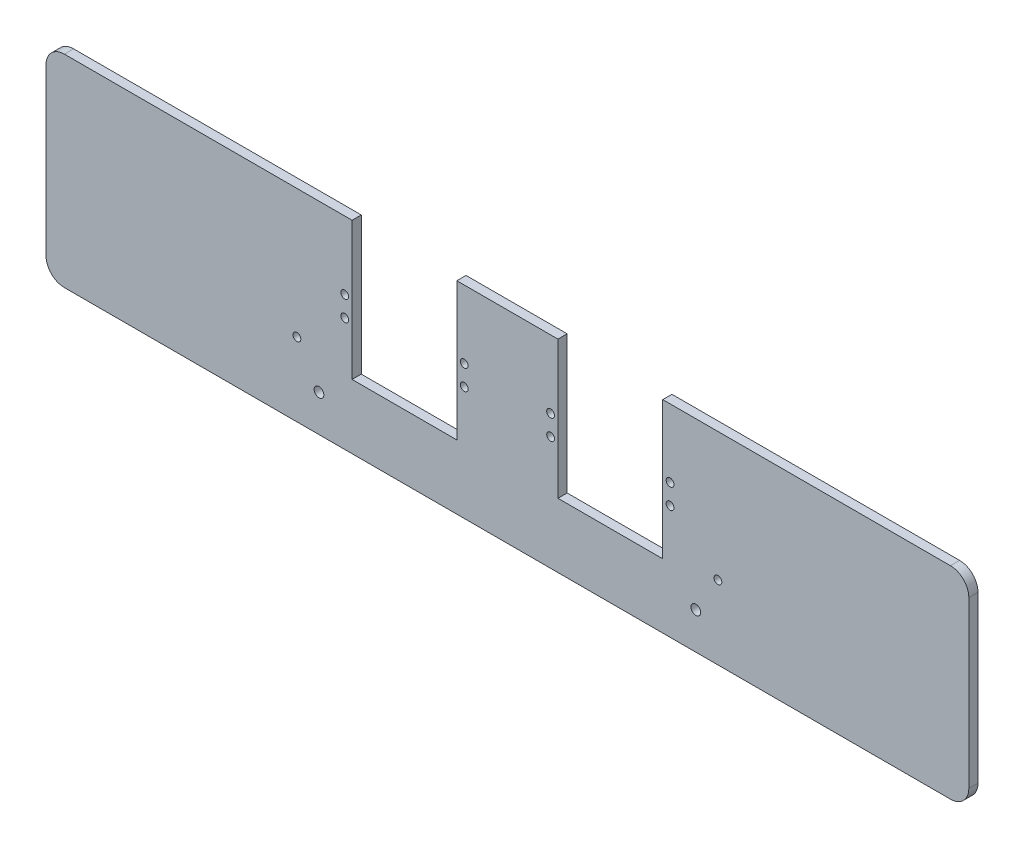
ISO-10303-21;
HEADER;
FILE_DESCRIPTION(('STEP AP214'),'2;1');
FILE_NAME('part.step','',(''),(''),'','','');
FILE_SCHEMA(('AUTOMOTIVE_DESIGN { 1 0 10303 214 1 1 1 1 }'));
ENDSEC;
DATA;
#1=APPLICATION_CONTEXT('core data for automotive mechanical design processes');
#2=APPLICATION_PROTOCOL_DEFINITION('international standard','automotive_design',2000,#1);
#3=PRODUCT_CONTEXT('',#1,'mechanical');
#4=PRODUCT('Part','Part','',(#3));
#5=PRODUCT_RELATED_PRODUCT_CATEGORY('part','',(#4));
#6=PRODUCT_DEFINITION_FORMATION('','',#4);
#7=PRODUCT_DEFINITION_CONTEXT('part definition',#1,'design');
#8=PRODUCT_DEFINITION('design','',#6,#7);
#9=PRODUCT_DEFINITION_SHAPE('','',#8);
#10=(LENGTH_UNIT() NAMED_UNIT(*) SI_UNIT(.MILLI.,.METRE.));
#11=(NAMED_UNIT(*) PLANE_ANGLE_UNIT() SI_UNIT($,.RADIAN.));
#12=(NAMED_UNIT(*) SI_UNIT($,.STERADIAN.) SOLID_ANGLE_UNIT());
#13=UNCERTAINTY_MEASURE_WITH_UNIT(LENGTH_MEASURE(1.E-05),#10,'distance_accuracy_value','');
#14=(GEOMETRIC_REPRESENTATION_CONTEXT(3) GLOBAL_UNCERTAINTY_ASSIGNED_CONTEXT((#13)) GLOBAL_UNIT_ASSIGNED_CONTEXT((#10,
#11,#12)) REPRESENTATION_CONTEXT('',''));
#15=CARTESIAN_POINT('',(0.,0.,0.));
#16=DIRECTION('',(0.,0.,1.));
#17=DIRECTION('',(1.,0.,0.));
#18=AXIS2_PLACEMENT_3D('',#15,#16,#17);
#19=CARTESIAN_POINT('',(502.,0.,5.));
#20=DIRECTION('',(0.,1.,0.));
#21=DIRECTION('',(-1.,0.,0.));
#22=AXIS2_PLACEMENT_3D('',#19,#20,#21);
#23=PLANE('',#22);
#24=DIRECTION('',(1.,0.,0.));
#25=VECTOR('',#24,1.);
#26=CARTESIAN_POINT('',(502.,0.,0.));
#27=LINE('',#26,#25);
#28=CARTESIAN_POINT('',(10.,0.,0.));
#29=VERTEX_POINT('',#28);
#30=CARTESIAN_POINT('',(492.,0.,0.));
#31=VERTEX_POINT('',#30);
#32=EDGE_CURVE('E217',#29,#31,#27,.T.);
#33=ORIENTED_EDGE('',*,*,#32,.T.);
#34=DIRECTION('',(0.,0.,-1.));
#35=VECTOR('',#34,1.);
#36=CARTESIAN_POINT('',(492.,0.,5.));
#37=LINE('',#36,#35);
#38=CARTESIAN_POINT('',(492.,0.,5.));
#39=VERTEX_POINT('',#38);
#40=EDGE_CURVE('E336',#31,#39,#37,.F.);
#41=ORIENTED_EDGE('',*,*,#40,.T.);
#42=DIRECTION('',(1.,0.,0.));
#43=VECTOR('',#42,1.);
#44=CARTESIAN_POINT('',(502.,0.,5.));
#45=LINE('',#44,#43);
#46=CARTESIAN_POINT('',(10.,0.,5.));
#47=VERTEX_POINT('',#46);
#48=EDGE_CURVE('E256',#47,#39,#45,.T.);
#49=ORIENTED_EDGE('',*,*,#48,.F.);
#50=DIRECTION('',(0.,0.,-1.));
#51=VECTOR('',#50,1.);
#52=CARTESIAN_POINT('',(10.,0.,5.));
#53=LINE('',#52,#51);
#54=EDGE_CURVE('E332',#47,#29,#53,.T.);
#55=ORIENTED_EDGE('',*,*,#54,.T.);
#56=EDGE_LOOP('',(#33,#41,#49,#55));
#57=FACE_BOUND('',#56,.T.);
#58=ADVANCED_FACE('F44',(#57),#23,.F.);
#59=CARTESIAN_POINT('',(502.,110.,5.));
#60=DIRECTION('',(-1.,0.,0.));
#61=DIRECTION('',(0.,0.,1.));
#62=AXIS2_PLACEMENT_3D('',#59,#60,#61);
#63=PLANE('',#62);
#64=DIRECTION('',(0.,1.,0.));
#65=VECTOR('',#64,1.);
#66=CARTESIAN_POINT('',(502.,110.,5.));
#67=LINE('',#66,#65);
#68=CARTESIAN_POINT('',(502.,10.,5.));
#69=VERTEX_POINT('',#68);
#70=CARTESIAN_POINT('',(502.,100.,5.));
#71=VERTEX_POINT('',#70);
#72=EDGE_CURVE('E172',#69,#71,#67,.T.);
#73=ORIENTED_EDGE('',*,*,#72,.F.);
#74=DIRECTION('',(0.,0.,-1.));
#75=VECTOR('',#74,1.);
#76=CARTESIAN_POINT('',(502.,10.,5.));
#77=LINE('',#76,#75);
#78=CARTESIAN_POINT('',(502.,10.,0.));
#79=VERTEX_POINT('',#78);
#80=EDGE_CURVE('E316',#69,#79,#77,.T.);
#81=ORIENTED_EDGE('',*,*,#80,.T.);
#82=DIRECTION('',(0.,1.,0.));
#83=VECTOR('',#82,1.);
#84=CARTESIAN_POINT('',(502.,110.,0.));
#85=LINE('',#84,#83);
#86=CARTESIAN_POINT('',(502.,100.,0.));
#87=VERTEX_POINT('',#86);
#88=EDGE_CURVE('E221',#79,#87,#85,.T.);
#89=ORIENTED_EDGE('',*,*,#88,.T.);
#90=DIRECTION('',(0.,0.,-1.));
#91=VECTOR('',#90,1.);
#92=CARTESIAN_POINT('',(502.,100.,5.));
#93=LINE('',#92,#91);
#94=EDGE_CURVE('E182',#87,#71,#93,.F.);
#95=ORIENTED_EDGE('',*,*,#94,.T.);
#96=EDGE_LOOP('',(#73,#81,#89,#95));
#97=FACE_BOUND('',#96,.T.);
#98=ADVANCED_FACE('F482',(#97),#63,.F.);
#99=CARTESIAN_POINT('',(335.5,110.,5.));
#100=DIRECTION('',(0.,-1.,0.));
#101=DIRECTION('',(0.,0.,-1.));
#102=AXIS2_PLACEMENT_3D('',#99,#100,#101);
#103=PLANE('',#102);
#104=DIRECTION('',(-1.,0.,0.));
#105=VECTOR('',#104,1.);
#106=CARTESIAN_POINT('',(335.5,110.,5.));
#107=LINE('',#106,#105);
#108=CARTESIAN_POINT('',(492.,110.,5.));
#109=VERTEX_POINT('',#108);
#110=CARTESIAN_POINT('',(335.5,110.,5.));
#111=VERTEX_POINT('',#110);
#112=EDGE_CURVE('E158',#109,#111,#107,.T.);
#113=ORIENTED_EDGE('',*,*,#112,.F.);
#114=DIRECTION('',(0.,0.,-1.));
#115=VECTOR('',#114,1.);
#116=CARTESIAN_POINT('',(492.,110.,5.));
#117=LINE('',#116,#115);
#118=CARTESIAN_POINT('',(492.,110.,0.));
#119=VERTEX_POINT('',#118);
#120=EDGE_CURVE('E349',#109,#119,#117,.T.);
#121=ORIENTED_EDGE('',*,*,#120,.T.);
#122=DIRECTION('',(-1.,0.,0.));
#123=VECTOR('',#122,1.);
#124=CARTESIAN_POINT('',(335.5,110.,0.));
#125=LINE('',#124,#123);
#126=CARTESIAN_POINT('',(335.5,110.,0.));
#127=VERTEX_POINT('',#126);
#128=EDGE_CURVE('E178',#119,#127,#125,.T.);
#129=ORIENTED_EDGE('',*,*,#128,.T.);
#130=DIRECTION('',(0.,0.,-1.));
#131=VECTOR('',#130,1.);
#132=CARTESIAN_POINT('',(335.5,110.,5.));
#133=LINE('',#132,#131);
#134=EDGE_CURVE('E175',#111,#127,#133,.T.);
#135=ORIENTED_EDGE('',*,*,#134,.F.);
#136=EDGE_LOOP('',(#113,#121,#129,#135));
#137=FACE_BOUND('',#136,.T.);
#138=ADVANCED_FACE('F176',(#137),#103,.F.);
#139=CARTESIAN_POINT('',(335.5,35.,5.));
#140=DIRECTION('',(1.,0.,0.));
#141=DIRECTION('',(0.,0.,-1.));
#142=AXIS2_PLACEMENT_3D('',#139,#140,#141);
#143=PLANE('',#142);
#144=DIRECTION('',(0.,-1.,0.));
#145=VECTOR('',#144,1.);
#146=CARTESIAN_POINT('',(335.5,35.,0.));
#147=LINE('',#146,#145);
#148=CARTESIAN_POINT('',(335.5,35.,0.));
#149=VERTEX_POINT('',#148);
#150=EDGE_CURVE('E228',#127,#149,#147,.T.);
#151=ORIENTED_EDGE('',*,*,#150,.T.);
#152=DIRECTION('',(0.,0.,-1.));
#153=VECTOR('',#152,1.);
#154=CARTESIAN_POINT('',(335.5,35.,5.));
#155=LINE('',#154,#153);
#156=CARTESIAN_POINT('',(335.5,35.,5.));
#157=VERTEX_POINT('',#156);
#158=EDGE_CURVE('E183',#157,#149,#155,.T.);
#159=ORIENTED_EDGE('',*,*,#158,.F.);
#160=DIRECTION('',(0.,-1.,0.));
#161=VECTOR('',#160,1.);
#162=CARTESIAN_POINT('',(335.5,35.,5.));
#163=LINE('',#162,#161);
#164=EDGE_CURVE('E163',#111,#157,#163,.T.);
#165=ORIENTED_EDGE('',*,*,#164,.F.);
#166=ORIENTED_EDGE('',*,*,#134,.T.);
#167=EDGE_LOOP('',(#151,#159,#165,#166));
#168=FACE_BOUND('',#167,.T.);
#169=ADVANCED_FACE('F185',(#168),#143,.F.);
#170=CARTESIAN_POINT('',(278.5,35.,5.));
#171=DIRECTION('',(0.,-1.,0.));
#172=DIRECTION('',(1.,0.,0.));
#173=AXIS2_PLACEMENT_3D('',#170,#171,#172);
#174=PLANE('',#173);
#175=DIRECTION('',(-1.,0.,0.));
#176=VECTOR('',#175,1.);
#177=CARTESIAN_POINT('',(278.5,35.,0.));
#178=LINE('',#177,#176);
#179=CARTESIAN_POINT('',(278.5,35.,0.));
#180=VERTEX_POINT('',#179);
#181=EDGE_CURVE('E231',#149,#180,#178,.T.);
#182=ORIENTED_EDGE('',*,*,#181,.T.);
#183=DIRECTION('',(0.,0.,-1.));
#184=VECTOR('',#183,1.);
#185=CARTESIAN_POINT('',(278.5,35.,5.));
#186=LINE('',#185,#184);
#187=CARTESIAN_POINT('',(278.5,35.,5.));
#188=VERTEX_POINT('',#187);
#189=EDGE_CURVE('E276',#188,#180,#186,.T.);
#190=ORIENTED_EDGE('',*,*,#189,.F.);
#191=DIRECTION('',(-1.,0.,0.));
#192=VECTOR('',#191,1.);
#193=CARTESIAN_POINT('',(278.5,35.,5.));
#194=LINE('',#193,#192);
#195=EDGE_CURVE('E189',#157,#188,#194,.T.);
#196=ORIENTED_EDGE('',*,*,#195,.F.);
#197=ORIENTED_EDGE('',*,*,#158,.T.);
#198=EDGE_LOOP('',(#182,#190,#196,#197));
#199=FACE_BOUND('',#198,.T.);
#200=ADVANCED_FACE('F437',(#199),#174,.F.);
#201=CARTESIAN_POINT('',(278.5,110.,5.));
#202=DIRECTION('',(-1.,0.,0.));
#203=DIRECTION('',(0.,0.,1.));
#204=AXIS2_PLACEMENT_3D('',#201,#202,#203);
#205=PLANE('',#204);
#206=DIRECTION('',(0.,1.,0.));
#207=VECTOR('',#206,1.);
#208=CARTESIAN_POINT('',(278.5,110.,0.));
#209=LINE('',#208,#207);
#210=CARTESIAN_POINT('',(278.5,110.,0.));
#211=VERTEX_POINT('',#210);
#212=EDGE_CURVE('E234',#180,#211,#209,.T.);
#213=ORIENTED_EDGE('',*,*,#212,.T.);
#214=DIRECTION('',(0.,0.,-1.));
#215=VECTOR('',#214,1.);
#216=CARTESIAN_POINT('',(278.5,110.,5.));
#217=LINE('',#216,#215);
#218=CARTESIAN_POINT('',(278.5,110.,5.));
#219=VERTEX_POINT('',#218);
#220=EDGE_CURVE('E272',#219,#211,#217,.T.);
#221=ORIENTED_EDGE('',*,*,#220,.F.);
#222=DIRECTION('',(0.,1.,0.));
#223=VECTOR('',#222,1.);
#224=CARTESIAN_POINT('',(278.5,110.,5.));
#225=LINE('',#224,#223);
#226=EDGE_CURVE('E192',#188,#219,#225,.T.);
#227=ORIENTED_EDGE('',*,*,#226,.F.);
#228=ORIENTED_EDGE('',*,*,#189,.T.);
#229=EDGE_LOOP('',(#213,#221,#227,#228));
#230=FACE_BOUND('',#229,.T.);
#231=ADVANCED_FACE('F444',(#230),#205,.F.);
#232=CARTESIAN_POINT('',(223.5,110.,5.));
#233=DIRECTION('',(0.,-1.,0.));
#234=DIRECTION('',(0.,0.,-1.));
#235=AXIS2_PLACEMENT_3D('',#232,#233,#234);
#236=PLANE('',#235);
#237=DIRECTION('',(-1.,0.,0.));
#238=VECTOR('',#237,1.);
#239=CARTESIAN_POINT('',(223.5,110.,0.));
#240=LINE('',#239,#238);
#241=CARTESIAN_POINT('',(223.5,110.,0.));
#242=VERTEX_POINT('',#241);
#243=EDGE_CURVE('E237',#211,#242,#240,.T.);
#244=ORIENTED_EDGE('',*,*,#243,.T.);
#245=DIRECTION('',(0.,0.,-1.));
#246=VECTOR('',#245,1.);
#247=CARTESIAN_POINT('',(223.5,110.,5.));
#248=LINE('',#247,#246);
#249=CARTESIAN_POINT('',(223.5,110.,5.));
#250=VERTEX_POINT('',#249);
#251=EDGE_CURVE('E268',#250,#242,#248,.T.);
#252=ORIENTED_EDGE('',*,*,#251,.F.);
#253=DIRECTION('',(-1.,0.,0.));
#254=VECTOR('',#253,1.);
#255=CARTESIAN_POINT('',(223.5,110.,5.));
#256=LINE('',#255,#254);
#257=EDGE_CURVE('E198',#219,#250,#256,.T.);
#258=ORIENTED_EDGE('',*,*,#257,.F.);
#259=ORIENTED_EDGE('',*,*,#220,.T.);
#260=EDGE_LOOP('',(#244,#252,#258,#259));
#261=FACE_BOUND('',#260,.T.);
#262=ADVANCED_FACE('F447',(#261),#236,.F.);
#263=CARTESIAN_POINT('',(223.5,35.,5.));
#264=DIRECTION('',(1.,0.,0.));
#265=DIRECTION('',(0.,1.,0.));
#266=AXIS2_PLACEMENT_3D('',#263,#264,#265);
#267=PLANE('',#266);
#268=DIRECTION('',(0.,-1.,0.));
#269=VECTOR('',#268,1.);
#270=CARTESIAN_POINT('',(223.5,35.,0.));
#271=LINE('',#270,#269);
#272=CARTESIAN_POINT('',(223.5,35.,0.));
#273=VERTEX_POINT('',#272);
#274=EDGE_CURVE('E240',#242,#273,#271,.T.);
#275=ORIENTED_EDGE('',*,*,#274,.T.);
#276=DIRECTION('',(0.,0.,-1.));
#277=VECTOR('',#276,1.);
#278=CARTESIAN_POINT('',(223.5,35.,5.));
#279=LINE('',#278,#277);
#280=CARTESIAN_POINT('',(223.5,35.,5.));
#281=VERTEX_POINT('',#280);
#282=EDGE_CURVE('E264',#281,#273,#279,.T.);
#283=ORIENTED_EDGE('',*,*,#282,.F.);
#284=DIRECTION('',(0.,-1.,0.));
#285=VECTOR('',#284,1.);
#286=CARTESIAN_POINT('',(223.5,35.,5.));
#287=LINE('',#286,#285);
#288=EDGE_CURVE('E201',#250,#281,#287,.T.);
#289=ORIENTED_EDGE('',*,*,#288,.F.);
#290=ORIENTED_EDGE('',*,*,#251,.T.);
#291=EDGE_LOOP('',(#275,#283,#289,#290));
#292=FACE_BOUND('',#291,.T.);
#293=ADVANCED_FACE('F452',(#292),#267,.F.);
#294=CARTESIAN_POINT('',(166.5,35.,5.));
#295=DIRECTION('',(0.,-1.,0.));
#296=DIRECTION('',(0.,0.,-1.));
#297=AXIS2_PLACEMENT_3D('',#294,#295,#296);
#298=PLANE('',#297);
#299=DIRECTION('',(-1.,0.,0.));
#300=VECTOR('',#299,1.);
#301=CARTESIAN_POINT('',(166.5,35.,0.));
#302=LINE('',#301,#300);
#303=CARTESIAN_POINT('',(166.5,35.,0.));
#304=VERTEX_POINT('',#303);
#305=EDGE_CURVE('E243',#273,#304,#302,.T.);
#306=ORIENTED_EDGE('',*,*,#305,.T.);
#307=DIRECTION('',(0.,0.,-1.));
#308=VECTOR('',#307,1.);
#309=CARTESIAN_POINT('',(166.5,35.,5.));
#310=LINE('',#309,#308);
#311=CARTESIAN_POINT('',(166.5,35.,5.));
#312=VERTEX_POINT('',#311);
#313=EDGE_CURVE('E260',#312,#304,#310,.T.);
#314=ORIENTED_EDGE('',*,*,#313,.F.);
#315=DIRECTION('',(-1.,0.,0.));
#316=VECTOR('',#315,1.);
#317=CARTESIAN_POINT('',(166.5,35.,5.));
#318=LINE('',#317,#316);
#319=EDGE_CURVE('E204',#281,#312,#318,.T.);
#320=ORIENTED_EDGE('',*,*,#319,.F.);
#321=ORIENTED_EDGE('',*,*,#282,.T.);
#322=EDGE_LOOP('',(#306,#314,#320,#321));
#323=FACE_BOUND('',#322,.T.);
#324=ADVANCED_FACE('F458',(#323),#298,.F.);
#325=CARTESIAN_POINT('',(166.5,110.,5.));
#326=DIRECTION('',(-1.,0.,0.));
#327=DIRECTION('',(0.,-1.,0.));
#328=AXIS2_PLACEMENT_3D('',#325,#326,#327);
#329=PLANE('',#328);
#330=DIRECTION('',(0.,1.,0.));
#331=VECTOR('',#330,1.);
#332=CARTESIAN_POINT('',(166.5,110.,0.));
#333=LINE('',#332,#331);
#334=CARTESIAN_POINT('',(166.5,110.,0.));
#335=VERTEX_POINT('',#334);
#336=EDGE_CURVE('E246',#304,#335,#333,.T.);
#337=ORIENTED_EDGE('',*,*,#336,.T.);
#338=DIRECTION('',(0.,0.,-1.));
#339=VECTOR('',#338,1.);
#340=CARTESIAN_POINT('',(166.5,110.,5.));
#341=LINE('',#340,#339);
#342=CARTESIAN_POINT('',(166.5,110.,5.));
#343=VERTEX_POINT('',#342);
#344=EDGE_CURVE('E216',#343,#335,#341,.T.);
#345=ORIENTED_EDGE('',*,*,#344,.F.);
#346=DIRECTION('',(0.,1.,0.));
#347=VECTOR('',#346,1.);
#348=CARTESIAN_POINT('',(166.5,110.,5.));
#349=LINE('',#348,#347);
#350=EDGE_CURVE('E207',#312,#343,#349,.T.);
#351=ORIENTED_EDGE('',*,*,#350,.F.);
#352=ORIENTED_EDGE('',*,*,#313,.T.);
#353=EDGE_LOOP('',(#337,#345,#351,#352));
#354=FACE_BOUND('',#353,.T.);
#355=ADVANCED_FACE('F462',(#354),#329,.F.);
#356=CARTESIAN_POINT('',(0.,110.,5.));
#357=DIRECTION('',(0.,-1.,0.));
#358=DIRECTION('',(0.,0.,-1.));
#359=AXIS2_PLACEMENT_3D('',#356,#357,#358);
#360=PLANE('',#359);
#361=DIRECTION('',(-1.,0.,0.));
#362=VECTOR('',#361,1.);
#363=CARTESIAN_POINT('',(0.,110.,0.));
#364=LINE('',#363,#362);
#365=CARTESIAN_POINT('',(10.,110.,0.));
#366=VERTEX_POINT('',#365);
#367=EDGE_CURVE('E249',#335,#366,#364,.T.);
#368=ORIENTED_EDGE('',*,*,#367,.T.);
#369=DIRECTION('',(0.,0.,-1.));
#370=VECTOR('',#369,1.);
#371=CARTESIAN_POINT('',(10.,110.,5.));
#372=LINE('',#371,#370);
#373=CARTESIAN_POINT('',(10.,110.,5.));
#374=VERTEX_POINT('',#373);
#375=EDGE_CURVE('E11',#366,#374,#372,.F.);
#376=ORIENTED_EDGE('',*,*,#375,.T.);
#377=DIRECTION('',(-1.,0.,0.));
#378=VECTOR('',#377,1.);
#379=CARTESIAN_POINT('',(0.,110.,5.));
#380=LINE('',#379,#378);
#381=EDGE_CURVE('E210',#343,#374,#380,.T.);
#382=ORIENTED_EDGE('',*,*,#381,.F.);
#383=ORIENTED_EDGE('',*,*,#344,.T.);
#384=EDGE_LOOP('',(#368,#376,#382,#383));
#385=FACE_BOUND('',#384,.T.);
#386=ADVANCED_FACE('F466',(#385),#360,.F.);
#387=CARTESIAN_POINT('',(0.,0.,5.));
#388=DIRECTION('',(1.,0.,0.));
#389=DIRECTION('',(0.,0.,-1.));
#390=AXIS2_PLACEMENT_3D('',#387,#388,#389);
#391=PLANE('',#390);
#392=DIRECTION('',(0.,-1.,0.));
#393=VECTOR('',#392,1.);
#394=CARTESIAN_POINT('',(0.,0.,0.));
#395=LINE('',#394,#393);
#396=CARTESIAN_POINT('',(0.,100.,0.));
#397=VERTEX_POINT('',#396);
#398=CARTESIAN_POINT('',(0.,10.,0.));
#399=VERTEX_POINT('',#398);
#400=EDGE_CURVE('E253',#397,#399,#395,.T.);
#401=ORIENTED_EDGE('',*,*,#400,.T.);
#402=DIRECTION('',(0.,0.,-1.));
#403=VECTOR('',#402,1.);
#404=CARTESIAN_POINT('',(0.,10.,5.));
#405=LINE('',#404,#403);
#406=CARTESIAN_POINT('',(0.,10.,5.));
#407=VERTEX_POINT('',#406);
#408=EDGE_CURVE('E54',#399,#407,#405,.F.);
#409=ORIENTED_EDGE('',*,*,#408,.T.);
#410=DIRECTION('',(0.,-1.,0.));
#411=VECTOR('',#410,1.);
#412=CARTESIAN_POINT('',(0.,0.,5.));
#413=LINE('',#412,#411);
#414=CARTESIAN_POINT('',(0.,100.,5.));
#415=VERTEX_POINT('',#414);
#416=EDGE_CURVE('E213',#415,#407,#413,.T.);
#417=ORIENTED_EDGE('',*,*,#416,.F.);
#418=DIRECTION('',(0.,0.,-1.));
#419=VECTOR('',#418,1.);
#420=CARTESIAN_POINT('',(0.,100.,5.));
#421=LINE('',#420,#419);
#422=EDGE_CURVE('E352',#415,#397,#421,.T.);
#423=ORIENTED_EDGE('',*,*,#422,.T.);
#424=EDGE_LOOP('',(#401,#409,#417,#423));
#425=FACE_BOUND('',#424,.T.);
#426=ADVANCED_FACE('F471',(#425),#391,.F.);
#427=CARTESIAN_POINT('',(0.,0.,5.));
#428=DIRECTION('',(0.,0.,-1.));
#429=DIRECTION('',(-1.,0.,0.));
#430=AXIS2_PLACEMENT_3D('',#427,#428,#429);
#431=PLANE('',#430);
#432=CARTESIAN_POINT('',(365.5,40.,5.));
#433=DIRECTION('',(0.,0.,1.));
#434=DIRECTION('',(1.,0.,0.));
#435=AXIS2_PLACEMENT_3D('',#432,#433,#434);
#436=CIRCLE('',#435,2.125);
#437=CARTESIAN_POINT('',(367.625,40.,5.));
#438=VERTEX_POINT('',#437);
#439=EDGE_CURVE('E370',#438,#438,#436,.T.);
#440=ORIENTED_EDGE('',*,*,#439,.F.);
#441=EDGE_LOOP('',(#440));
#442=FACE_BOUND('',#441,.T.);
#443=CARTESIAN_POINT('',(136.5,40.,5.));
#444=DIRECTION('',(0.,0.,1.));
#445=DIRECTION('',(-1.,0.,0.));
#446=AXIS2_PLACEMENT_3D('',#443,#444,#445);
#447=CIRCLE('',#446,2.125);
#448=CARTESIAN_POINT('',(134.375,40.,5.));
#449=VERTEX_POINT('',#448);
#450=EDGE_CURVE('E378',#449,#449,#447,.T.);
#451=ORIENTED_EDGE('',*,*,#450,.F.);
#452=EDGE_LOOP('',(#451));
#453=FACE_BOUND('',#452,.T.);
#454=CARTESIAN_POINT('',(148.5,20.,5.));
#455=DIRECTION('',(0.,0.,1.));
#456=DIRECTION('',(1.,0.,0.));
#457=AXIS2_PLACEMENT_3D('',#454,#455,#456);
#458=CIRCLE('',#457,2.65000000000001);
#459=CARTESIAN_POINT('',(151.15,20.,5.));
#460=VERTEX_POINT('',#459);
#461=EDGE_CURVE('E363',#460,#460,#458,.T.);
#462=ORIENTED_EDGE('',*,*,#461,.F.);
#463=EDGE_LOOP('',(#462));
#464=FACE_BOUND('',#463,.T.);
#465=CARTESIAN_POINT('',(353.5,20.,5.));
#466=DIRECTION('',(0.,0.,1.));
#467=DIRECTION('',(-1.,0.,0.));
#468=AXIS2_PLACEMENT_3D('',#465,#466,#467);
#469=CIRCLE('',#468,2.64999999999999);
#470=CARTESIAN_POINT('',(350.85,20.,5.));
#471=VERTEX_POINT('',#470);
#472=EDGE_CURVE('E376',#471,#471,#469,.T.);
#473=ORIENTED_EDGE('',*,*,#472,.F.);
#474=EDGE_LOOP('',(#473));
#475=FACE_BOUND('',#474,.T.);
#476=CARTESIAN_POINT('',(162.5,62.,5.));
#477=DIRECTION('',(0.,0.,1.));
#478=DIRECTION('',(1.,0.,0.));
#479=AXIS2_PLACEMENT_3D('',#476,#477,#478);
#480=CIRCLE('',#479,2.125);
#481=CARTESIAN_POINT('',(164.625,62.,5.));
#482=VERTEX_POINT('',#481);
#483=EDGE_CURVE('E404',#482,#482,#480,.T.);
#484=ORIENTED_EDGE('',*,*,#483,.F.);
#485=EDGE_LOOP('',(#484));
#486=FACE_BOUND('',#485,.T.);
#487=CARTESIAN_POINT('',(227.5,62.,5.));
#488=DIRECTION('',(0.,0.,1.));
#489=DIRECTION('',(-1.,0.,0.));
#490=AXIS2_PLACEMENT_3D('',#487,#488,#489);
#491=CIRCLE('',#490,2.125);
#492=CARTESIAN_POINT('',(225.375,62.,5.));
#493=VERTEX_POINT('',#492);
#494=EDGE_CURVE('E408',#493,#493,#491,.T.);
#495=ORIENTED_EDGE('',*,*,#494,.F.);
#496=EDGE_LOOP('',(#495));
#497=FACE_BOUND('',#496,.T.);
#498=CARTESIAN_POINT('',(227.5,73.,5.));
#499=DIRECTION('',(0.,0.,1.));
#500=DIRECTION('',(-1.,0.,0.));
#501=AXIS2_PLACEMENT_3D('',#498,#499,#500);
#502=CIRCLE('',#501,2.125);
#503=CARTESIAN_POINT('',(225.375,73.,5.));
#504=VERTEX_POINT('',#503);
#505=EDGE_CURVE('E412',#504,#504,#502,.T.);
#506=ORIENTED_EDGE('',*,*,#505,.F.);
#507=EDGE_LOOP('',(#506));
#508=FACE_BOUND('',#507,.T.);
#509=CARTESIAN_POINT('',(274.5,73.,5.));
#510=DIRECTION('',(0.,0.,1.));
#511=DIRECTION('',(1.,0.,0.));
#512=AXIS2_PLACEMENT_3D('',#509,#510,#511);
#513=CIRCLE('',#512,2.125);
#514=CARTESIAN_POINT('',(276.625,73.,5.));
#515=VERTEX_POINT('',#514);
#516=EDGE_CURVE('E396',#515,#515,#513,.T.);
#517=ORIENTED_EDGE('',*,*,#516,.F.);
#518=EDGE_LOOP('',(#517));
#519=FACE_BOUND('',#518,.T.);
#520=CARTESIAN_POINT('',(274.5,62.,5.));
#521=DIRECTION('',(0.,0.,1.));
#522=DIRECTION('',(1.,0.,0.));
#523=AXIS2_PLACEMENT_3D('',#520,#521,#522);
#524=CIRCLE('',#523,2.125);
#525=CARTESIAN_POINT('',(276.625,62.,5.));
#526=VERTEX_POINT('',#525);
#527=EDGE_CURVE('E392',#526,#526,#524,.T.);
#528=ORIENTED_EDGE('',*,*,#527,.F.);
#529=EDGE_LOOP('',(#528));
#530=FACE_BOUND('',#529,.T.);
#531=CARTESIAN_POINT('',(339.5,62.,5.));
#532=DIRECTION('',(0.,0.,1.));
#533=DIRECTION('',(-1.,0.,0.));
#534=AXIS2_PLACEMENT_3D('',#531,#532,#533);
#535=CIRCLE('',#534,2.125);
#536=CARTESIAN_POINT('',(337.375,62.,5.));
#537=VERTEX_POINT('',#536);
#538=EDGE_CURVE('E397',#537,#537,#535,.T.);
#539=ORIENTED_EDGE('',*,*,#538,.F.);
#540=EDGE_LOOP('',(#539));
#541=FACE_BOUND('',#540,.T.);
#542=CARTESIAN_POINT('',(339.5,73.,5.));
#543=DIRECTION('',(0.,0.,1.));
#544=DIRECTION('',(-1.,0.,0.));
#545=AXIS2_PLACEMENT_3D('',#542,#543,#544);
#546=CIRCLE('',#545,2.125);
#547=CARTESIAN_POINT('',(337.375,73.,5.));
#548=VERTEX_POINT('',#547);
#549=EDGE_CURVE('E366',#548,#548,#546,.T.);
#550=ORIENTED_EDGE('',*,*,#549,.F.);
#551=EDGE_LOOP('',(#550));
#552=FACE_BOUND('',#551,.T.);
#553=CARTESIAN_POINT('',(162.5,73.,5.));
#554=DIRECTION('',(0.,0.,1.));
#555=DIRECTION('',(1.,0.,0.));
#556=AXIS2_PLACEMENT_3D('',#553,#554,#555);
#557=CIRCLE('',#556,2.125);
#558=CARTESIAN_POINT('',(164.625,73.,5.));
#559=VERTEX_POINT('',#558);
#560=EDGE_CURVE('E287',#559,#559,#557,.T.);
#561=ORIENTED_EDGE('',*,*,#560,.F.);
#562=EDGE_LOOP('',(#561));
#563=FACE_BOUND('',#562,.T.);
#564=ORIENTED_EDGE('',*,*,#48,.T.);
#565=CARTESIAN_POINT('',(492.,10.,5.));
#566=DIRECTION('',(0.,0.,-1.));
#567=DIRECTION('',(-1.,0.,0.));
#568=AXIS2_PLACEMENT_3D('',#565,#566,#567);
#569=CIRCLE('',#568,10.);
#570=EDGE_CURVE('E346',#39,#69,#569,.F.);
#571=ORIENTED_EDGE('',*,*,#570,.T.);
#572=ORIENTED_EDGE('',*,*,#72,.T.);
#573=CARTESIAN_POINT('',(492.,100.,5.));
#574=DIRECTION('',(0.,0.,-1.));
#575=DIRECTION('',(-1.,0.,0.));
#576=AXIS2_PLACEMENT_3D('',#573,#574,#575);
#577=CIRCLE('',#576,10.);
#578=EDGE_CURVE('E167',#71,#109,#577,.F.);
#579=ORIENTED_EDGE('',*,*,#578,.T.);
#580=ORIENTED_EDGE('',*,*,#112,.T.);
#581=ORIENTED_EDGE('',*,*,#164,.T.);
#582=ORIENTED_EDGE('',*,*,#195,.T.);
#583=ORIENTED_EDGE('',*,*,#226,.T.);
#584=ORIENTED_EDGE('',*,*,#257,.T.);
#585=ORIENTED_EDGE('',*,*,#288,.T.);
#586=ORIENTED_EDGE('',*,*,#319,.T.);
#587=ORIENTED_EDGE('',*,*,#350,.T.);
#588=ORIENTED_EDGE('',*,*,#381,.T.);
#589=CARTESIAN_POINT('',(10.,100.,5.));
#590=DIRECTION('',(0.,0.,-1.));
#591=DIRECTION('',(-1.,0.,0.));
#592=AXIS2_PLACEMENT_3D('',#589,#590,#591);
#593=CIRCLE('',#592,10.);
#594=EDGE_CURVE('E68',#374,#415,#593,.F.);
#595=ORIENTED_EDGE('',*,*,#594,.T.);
#596=ORIENTED_EDGE('',*,*,#416,.T.);
#597=CARTESIAN_POINT('',(10.,10.,5.));
#598=DIRECTION('',(0.,0.,-1.));
#599=DIRECTION('',(-1.,0.,0.));
#600=AXIS2_PLACEMENT_3D('',#597,#598,#599);
#601=CIRCLE('',#600,10.);
#602=EDGE_CURVE('E341',#407,#47,#601,.F.);
#603=ORIENTED_EDGE('',*,*,#602,.T.);
#604=EDGE_LOOP('',(#564,#571,#572,#579,#580,#581,#582,#583,#584,#585,#586,#587,#588,#595,#596,#603));
#605=FACE_BOUND('',#604,.T.);
#606=ADVANCED_FACE('F161',(#442,#453,#464,#475,#486,#497,#508,#519,#530,#541,#552,#563,#605),
#431,.F.);
#607=CARTESIAN_POINT('',(0.,0.,0.));
#608=DIRECTION('',(0.,0.,-1.));
#609=DIRECTION('',(-1.,0.,0.));
#610=AXIS2_PLACEMENT_3D('',#607,#608,#609);
#611=PLANE('',#610);
#612=CARTESIAN_POINT('',(365.5,40.,0.));
#613=DIRECTION('',(0.,0.,-1.));
#614=DIRECTION('',(-1.,0.,0.));
#615=AXIS2_PLACEMENT_3D('',#612,#613,#614);
#616=CIRCLE('',#615,2.125);
#617=CARTESIAN_POINT('',(363.375,40.,0.));
#618=VERTEX_POINT('',#617);
#619=EDGE_CURVE('E48',#618,#618,#616,.T.);
#620=ORIENTED_EDGE('',*,*,#619,.F.);
#621=EDGE_LOOP('',(#620));
#622=FACE_BOUND('',#621,.T.);
#623=CARTESIAN_POINT('',(136.5,40.,0.));
#624=DIRECTION('',(0.,0.,-1.));
#625=DIRECTION('',(-1.,0.,0.));
#626=AXIS2_PLACEMENT_3D('',#623,#624,#625);
#627=CIRCLE('',#626,2.125);
#628=CARTESIAN_POINT('',(134.375,40.,0.));
#629=VERTEX_POINT('',#628);
#630=EDGE_CURVE('E367',#629,#629,#627,.T.);
#631=ORIENTED_EDGE('',*,*,#630,.F.);
#632=EDGE_LOOP('',(#631));
#633=FACE_BOUND('',#632,.T.);
#634=CARTESIAN_POINT('',(148.5,20.,0.));
#635=DIRECTION('',(0.,0.,-1.));
#636=DIRECTION('',(-1.,0.,0.));
#637=AXIS2_PLACEMENT_3D('',#634,#635,#636);
#638=CIRCLE('',#637,2.65000000000001);
#639=CARTESIAN_POINT('',(145.85,20.,0.));
#640=VERTEX_POINT('',#639);
#641=EDGE_CURVE('E362',#640,#640,#638,.T.);
#642=ORIENTED_EDGE('',*,*,#641,.F.);
#643=EDGE_LOOP('',(#642));
#644=FACE_BOUND('',#643,.T.);
#645=CARTESIAN_POINT('',(353.5,20.,0.));
#646=DIRECTION('',(0.,0.,-1.));
#647=DIRECTION('',(-1.,0.,0.));
#648=AXIS2_PLACEMENT_3D('',#645,#646,#647);
#649=CIRCLE('',#648,2.64999999999999);
#650=CARTESIAN_POINT('',(350.85,20.,0.));
#651=VERTEX_POINT('',#650);
#652=EDGE_CURVE('E358',#651,#651,#649,.T.);
#653=ORIENTED_EDGE('',*,*,#652,.F.);
#654=EDGE_LOOP('',(#653));
#655=FACE_BOUND('',#654,.T.);
#656=CARTESIAN_POINT('',(162.5,62.,0.));
#657=DIRECTION('',(0.,0.,-1.));
#658=DIRECTION('',(-1.,0.,0.));
#659=AXIS2_PLACEMENT_3D('',#656,#657,#658);
#660=CIRCLE('',#659,2.125);
#661=CARTESIAN_POINT('',(160.375,62.,0.));
#662=VERTEX_POINT('',#661);
#663=EDGE_CURVE('E222',#662,#662,#660,.T.);
#664=ORIENTED_EDGE('',*,*,#663,.F.);
#665=EDGE_LOOP('',(#664));
#666=FACE_BOUND('',#665,.T.);
#667=CARTESIAN_POINT('',(227.5,62.,0.));
#668=DIRECTION('',(0.,0.,-1.));
#669=DIRECTION('',(-1.,0.,0.));
#670=AXIS2_PLACEMENT_3D('',#667,#668,#669);
#671=CIRCLE('',#670,2.125);
#672=CARTESIAN_POINT('',(225.375,62.,0.));
#673=VERTEX_POINT('',#672);
#674=EDGE_CURVE('E307',#673,#673,#671,.T.);
#675=ORIENTED_EDGE('',*,*,#674,.F.);
#676=EDGE_LOOP('',(#675));
#677=FACE_BOUND('',#676,.T.);
#678=CARTESIAN_POINT('',(227.5,73.,0.));
#679=DIRECTION('',(0.,0.,-1.));
#680=DIRECTION('',(-1.,0.,0.));
#681=AXIS2_PLACEMENT_3D('',#678,#679,#680);
#682=CIRCLE('',#681,2.125);
#683=CARTESIAN_POINT('',(225.375,73.,0.));
#684=VERTEX_POINT('',#683);
#685=EDGE_CURVE('E303',#684,#684,#682,.T.);
#686=ORIENTED_EDGE('',*,*,#685,.F.);
#687=EDGE_LOOP('',(#686));
#688=FACE_BOUND('',#687,.T.);
#689=CARTESIAN_POINT('',(274.5,73.,0.));
#690=DIRECTION('',(0.,0.,-1.));
#691=DIRECTION('',(-1.,0.,0.));
#692=AXIS2_PLACEMENT_3D('',#689,#690,#691);
#693=CIRCLE('',#692,2.125);
#694=CARTESIAN_POINT('',(272.375,73.,0.));
#695=VERTEX_POINT('',#694);
#696=EDGE_CURVE('E299',#695,#695,#693,.T.);
#697=ORIENTED_EDGE('',*,*,#696,.F.);
#698=EDGE_LOOP('',(#697));
#699=FACE_BOUND('',#698,.T.);
#700=CARTESIAN_POINT('',(274.5,62.,0.));
#701=DIRECTION('',(0.,0.,-1.));
#702=DIRECTION('',(-1.,0.,0.));
#703=AXIS2_PLACEMENT_3D('',#700,#701,#702);
#704=CIRCLE('',#703,2.125);
#705=CARTESIAN_POINT('',(272.375,62.,0.));
#706=VERTEX_POINT('',#705);
#707=EDGE_CURVE('E295',#706,#706,#704,.T.);
#708=ORIENTED_EDGE('',*,*,#707,.F.);
#709=EDGE_LOOP('',(#708));
#710=FACE_BOUND('',#709,.T.);
#711=CARTESIAN_POINT('',(339.5,62.,0.));
#712=DIRECTION('',(0.,0.,-1.));
#713=DIRECTION('',(-1.,0.,0.));
#714=AXIS2_PLACEMENT_3D('',#711,#712,#713);
#715=CIRCLE('',#714,2.125);
#716=CARTESIAN_POINT('',(337.375,62.,0.));
#717=VERTEX_POINT('',#716);
#718=EDGE_CURVE('E291',#717,#717,#715,.T.);
#719=ORIENTED_EDGE('',*,*,#718,.F.);
#720=EDGE_LOOP('',(#719));
#721=FACE_BOUND('',#720,.T.);
#722=CARTESIAN_POINT('',(339.5,73.,0.));
#723=DIRECTION('',(0.,0.,-1.));
#724=DIRECTION('',(-1.,0.,0.));
#725=AXIS2_PLACEMENT_3D('',#722,#723,#724);
#726=CIRCLE('',#725,2.125);
#727=CARTESIAN_POINT('',(337.375,73.,0.));
#728=VERTEX_POINT('',#727);
#729=EDGE_CURVE('E286',#728,#728,#726,.T.);
#730=ORIENTED_EDGE('',*,*,#729,.F.);
#731=EDGE_LOOP('',(#730));
#732=FACE_BOUND('',#731,.T.);
#733=CARTESIAN_POINT('',(162.5,73.,0.));
#734=DIRECTION('',(0.,0.,-1.));
#735=DIRECTION('',(-1.,0.,0.));
#736=AXIS2_PLACEMENT_3D('',#733,#734,#735);
#737=CIRCLE('',#736,2.125);
#738=CARTESIAN_POINT('',(160.375,73.,0.));
#739=VERTEX_POINT('',#738);
#740=EDGE_CURVE('E282',#739,#739,#737,.T.);
#741=ORIENTED_EDGE('',*,*,#740,.F.);
#742=EDGE_LOOP('',(#741));
#743=FACE_BOUND('',#742,.T.);
#744=ORIENTED_EDGE('',*,*,#88,.F.);
#745=CARTESIAN_POINT('',(492.,10.,0.));
#746=DIRECTION('',(0.,0.,-1.));
#747=DIRECTION('',(-1.,0.,0.));
#748=AXIS2_PLACEMENT_3D('',#745,#746,#747);
#749=CIRCLE('',#748,10.);
#750=EDGE_CURVE('E329',#79,#31,#749,.T.);
#751=ORIENTED_EDGE('',*,*,#750,.T.);
#752=ORIENTED_EDGE('',*,*,#32,.F.);
#753=CARTESIAN_POINT('',(10.,10.,0.));
#754=DIRECTION('',(0.,0.,-1.));
#755=DIRECTION('',(-1.,0.,0.));
#756=AXIS2_PLACEMENT_3D('',#753,#754,#755);
#757=CIRCLE('',#756,10.);
#758=EDGE_CURVE('E323',#29,#399,#757,.T.);
#759=ORIENTED_EDGE('',*,*,#758,.T.);
#760=ORIENTED_EDGE('',*,*,#400,.F.);
#761=CARTESIAN_POINT('',(10.,100.,0.));
#762=DIRECTION('',(0.,0.,-1.));
#763=DIRECTION('',(-1.,0.,0.));
#764=AXIS2_PLACEMENT_3D('',#761,#762,#763);
#765=CIRCLE('',#764,10.);
#766=EDGE_CURVE('E320',#397,#366,#765,.T.);
#767=ORIENTED_EDGE('',*,*,#766,.T.);
#768=ORIENTED_EDGE('',*,*,#367,.F.);
#769=ORIENTED_EDGE('',*,*,#336,.F.);
#770=ORIENTED_EDGE('',*,*,#305,.F.);
#771=ORIENTED_EDGE('',*,*,#274,.F.);
#772=ORIENTED_EDGE('',*,*,#243,.F.);
#773=ORIENTED_EDGE('',*,*,#212,.F.);
#774=ORIENTED_EDGE('',*,*,#181,.F.);
#775=ORIENTED_EDGE('',*,*,#150,.F.);
#776=ORIENTED_EDGE('',*,*,#128,.F.);
#777=CARTESIAN_POINT('',(492.,100.,0.));
#778=DIRECTION('',(0.,0.,-1.));
#779=DIRECTION('',(-1.,0.,0.));
#780=AXIS2_PLACEMENT_3D('',#777,#778,#779);
#781=CIRCLE('',#780,10.);
#782=EDGE_CURVE('E326',#119,#87,#781,.T.);
#783=ORIENTED_EDGE('',*,*,#782,.T.);
#784=EDGE_LOOP('',(#744,#751,#752,#759,#760,#767,#768,#769,#770,#771,#772,#773,#774,#775,#776,#783));
#785=FACE_BOUND('',#784,.T.);
#786=ADVANCED_FACE('F433',(#622,#633,#644,#655,#666,#677,#688,#699,#710,#721,#732,#743,#785),
#611,.T.);
#787=CARTESIAN_POINT('',(162.5,73.,-5.));
#788=DIRECTION('',(0.,0.,1.));
#789=DIRECTION('',(1.,0.,0.));
#790=AXIS2_PLACEMENT_3D('',#787,#788,#789);
#791=CYLINDRICAL_SURFACE('',#790,2.125);
#792=ORIENTED_EDGE('',*,*,#740,.T.);
#793=EDGE_LOOP('',(#792));
#794=FACE_BOUND('',#793,.T.);
#795=ORIENTED_EDGE('',*,*,#560,.T.);
#796=EDGE_LOOP('',(#795));
#797=FACE_BOUND('',#796,.T.);
#798=ADVANCED_FACE('F529',(#794,#797),#791,.F.);
#799=CARTESIAN_POINT('',(339.5,73.,-5.));
#800=DIRECTION('',(0.,0.,1.));
#801=DIRECTION('',(1.,0.,0.));
#802=AXIS2_PLACEMENT_3D('',#799,#800,#801);
#803=CYLINDRICAL_SURFACE('',#802,2.125);
#804=ORIENTED_EDGE('',*,*,#729,.T.);
#805=EDGE_LOOP('',(#804));
#806=FACE_BOUND('',#805,.T.);
#807=ORIENTED_EDGE('',*,*,#549,.T.);
#808=EDGE_LOOP('',(#807));
#809=FACE_BOUND('',#808,.T.);
#810=ADVANCED_FACE('F525',(#806,#809),#803,.F.);
#811=CARTESIAN_POINT('',(339.5,62.,-5.));
#812=DIRECTION('',(0.,0.,1.));
#813=DIRECTION('',(1.,0.,0.));
#814=AXIS2_PLACEMENT_3D('',#811,#812,#813);
#815=CYLINDRICAL_SURFACE('',#814,2.125);
#816=ORIENTED_EDGE('',*,*,#718,.T.);
#817=EDGE_LOOP('',(#816));
#818=FACE_BOUND('',#817,.T.);
#819=ORIENTED_EDGE('',*,*,#538,.T.);
#820=EDGE_LOOP('',(#819));
#821=FACE_BOUND('',#820,.T.);
#822=ADVANCED_FACE('F521',(#818,#821),#815,.F.);
#823=CARTESIAN_POINT('',(274.5,62.,-5.));
#824=DIRECTION('',(0.,0.,1.));
#825=DIRECTION('',(1.,0.,0.));
#826=AXIS2_PLACEMENT_3D('',#823,#824,#825);
#827=CYLINDRICAL_SURFACE('',#826,2.125);
#828=ORIENTED_EDGE('',*,*,#707,.T.);
#829=EDGE_LOOP('',(#828));
#830=FACE_BOUND('',#829,.T.);
#831=ORIENTED_EDGE('',*,*,#527,.T.);
#832=EDGE_LOOP('',(#831));
#833=FACE_BOUND('',#832,.T.);
#834=ADVANCED_FACE('F517',(#830,#833),#827,.F.);
#835=CARTESIAN_POINT('',(274.5,73.,-5.));
#836=DIRECTION('',(0.,0.,1.));
#837=DIRECTION('',(1.,0.,0.));
#838=AXIS2_PLACEMENT_3D('',#835,#836,#837);
#839=CYLINDRICAL_SURFACE('',#838,2.125);
#840=ORIENTED_EDGE('',*,*,#696,.T.);
#841=EDGE_LOOP('',(#840));
#842=FACE_BOUND('',#841,.T.);
#843=ORIENTED_EDGE('',*,*,#516,.T.);
#844=EDGE_LOOP('',(#843));
#845=FACE_BOUND('',#844,.T.);
#846=ADVANCED_FACE('F520',(#842,#845),#839,.F.);
#847=CARTESIAN_POINT('',(227.5,73.,-5.));
#848=DIRECTION('',(0.,0.,1.));
#849=DIRECTION('',(1.,0.,0.));
#850=AXIS2_PLACEMENT_3D('',#847,#848,#849);
#851=CYLINDRICAL_SURFACE('',#850,2.125);
#852=ORIENTED_EDGE('',*,*,#685,.T.);
#853=EDGE_LOOP('',(#852));
#854=FACE_BOUND('',#853,.T.);
#855=ORIENTED_EDGE('',*,*,#505,.T.);
#856=EDGE_LOOP('',(#855));
#857=FACE_BOUND('',#856,.T.);
#858=ADVANCED_FACE('F537',(#854,#857),#851,.F.);
#859=CARTESIAN_POINT('',(227.5,62.,-5.));
#860=DIRECTION('',(0.,0.,1.));
#861=DIRECTION('',(1.,0.,0.));
#862=AXIS2_PLACEMENT_3D('',#859,#860,#861);
#863=CYLINDRICAL_SURFACE('',#862,2.125);
#864=ORIENTED_EDGE('',*,*,#674,.T.);
#865=EDGE_LOOP('',(#864));
#866=FACE_BOUND('',#865,.T.);
#867=ORIENTED_EDGE('',*,*,#494,.T.);
#868=EDGE_LOOP('',(#867));
#869=FACE_BOUND('',#868,.T.);
#870=ADVANCED_FACE('F533',(#866,#869),#863,.F.);
#871=CARTESIAN_POINT('',(162.5,62.,-5.));
#872=DIRECTION('',(0.,0.,1.));
#873=DIRECTION('',(1.,0.,0.));
#874=AXIS2_PLACEMENT_3D('',#871,#872,#873);
#875=CYLINDRICAL_SURFACE('',#874,2.125);
#876=ORIENTED_EDGE('',*,*,#663,.T.);
#877=EDGE_LOOP('',(#876));
#878=FACE_BOUND('',#877,.T.);
#879=ORIENTED_EDGE('',*,*,#483,.T.);
#880=EDGE_LOOP('',(#879));
#881=FACE_BOUND('',#880,.T.);
#882=ADVANCED_FACE('F495',(#878,#881),#875,.F.);
#883=CARTESIAN_POINT('',(492.,10.,5.));
#884=DIRECTION('',(0.,0.,-1.));
#885=DIRECTION('',(-1.,0.,0.));
#886=AXIS2_PLACEMENT_3D('',#883,#884,#885);
#887=CYLINDRICAL_SURFACE('',#886,10.);
#888=ORIENTED_EDGE('',*,*,#570,.F.);
#889=ORIENTED_EDGE('',*,*,#40,.F.);
#890=ORIENTED_EDGE('',*,*,#750,.F.);
#891=ORIENTED_EDGE('',*,*,#80,.F.);
#892=EDGE_LOOP('',(#888,#889,#890,#891));
#893=FACE_BOUND('',#892,.T.);
#894=ADVANCED_FACE('F481',(#893),#887,.T.);
#895=CARTESIAN_POINT('',(492.,100.,5.));
#896=DIRECTION('',(0.,0.,-1.));
#897=DIRECTION('',(-1.,0.,0.));
#898=AXIS2_PLACEMENT_3D('',#895,#896,#897);
#899=CYLINDRICAL_SURFACE('',#898,10.);
#900=ORIENTED_EDGE('',*,*,#578,.F.);
#901=ORIENTED_EDGE('',*,*,#94,.F.);
#902=ORIENTED_EDGE('',*,*,#782,.F.);
#903=ORIENTED_EDGE('',*,*,#120,.F.);
#904=EDGE_LOOP('',(#900,#901,#902,#903));
#905=FACE_BOUND('',#904,.T.);
#906=ADVANCED_FACE('F430',(#905),#899,.T.);
#907=CARTESIAN_POINT('',(10.,10.,5.));
#908=DIRECTION('',(0.,0.,-1.));
#909=DIRECTION('',(-1.,0.,0.));
#910=AXIS2_PLACEMENT_3D('',#907,#908,#909);
#911=CYLINDRICAL_SURFACE('',#910,10.);
#912=ORIENTED_EDGE('',*,*,#602,.F.);
#913=ORIENTED_EDGE('',*,*,#408,.F.);
#914=ORIENTED_EDGE('',*,*,#758,.F.);
#915=ORIENTED_EDGE('',*,*,#54,.F.);
#916=EDGE_LOOP('',(#912,#913,#914,#915));
#917=FACE_BOUND('',#916,.T.);
#918=ADVANCED_FACE('F476',(#917),#911,.T.);
#919=CARTESIAN_POINT('',(10.,100.,5.));
#920=DIRECTION('',(0.,0.,-1.));
#921=DIRECTION('',(-1.,0.,0.));
#922=AXIS2_PLACEMENT_3D('',#919,#920,#921);
#923=CYLINDRICAL_SURFACE('',#922,10.);
#924=ORIENTED_EDGE('',*,*,#594,.F.);
#925=ORIENTED_EDGE('',*,*,#375,.F.);
#926=ORIENTED_EDGE('',*,*,#766,.F.);
#927=ORIENTED_EDGE('',*,*,#422,.F.);
#928=EDGE_LOOP('',(#924,#925,#926,#927));
#929=FACE_BOUND('',#928,.T.);
#930=ADVANCED_FACE('F46',(#929),#923,.T.);
#931=CARTESIAN_POINT('',(353.5,20.,-5.));
#932=DIRECTION('',(0.,0.,1.));
#933=DIRECTION('',(1.,0.,0.));
#934=AXIS2_PLACEMENT_3D('',#931,#932,#933);
#935=CYLINDRICAL_SURFACE('',#934,2.64999999999999);
#936=ORIENTED_EDGE('',*,*,#652,.T.);
#937=EDGE_LOOP('',(#936));
#938=FACE_BOUND('',#937,.T.);
#939=ORIENTED_EDGE('',*,*,#472,.T.);
#940=EDGE_LOOP('',(#939));
#941=FACE_BOUND('',#940,.T.);
#942=ADVANCED_FACE('F501',(#938,#941),#935,.F.);
#943=CARTESIAN_POINT('',(148.5,20.,-5.));
#944=DIRECTION('',(0.,0.,1.));
#945=DIRECTION('',(1.,0.,0.));
#946=AXIS2_PLACEMENT_3D('',#943,#944,#945);
#947=CYLINDRICAL_SURFACE('',#946,2.65000000000001);
#948=ORIENTED_EDGE('',*,*,#641,.T.);
#949=EDGE_LOOP('',(#948));
#950=FACE_BOUND('',#949,.T.);
#951=ORIENTED_EDGE('',*,*,#461,.T.);
#952=EDGE_LOOP('',(#951));
#953=FACE_BOUND('',#952,.T.);
#954=ADVANCED_FACE('F505',(#950,#953),#947,.F.);
#955=CARTESIAN_POINT('',(136.5,40.,-5.));
#956=DIRECTION('',(0.,0.,1.));
#957=DIRECTION('',(1.,0.,0.));
#958=AXIS2_PLACEMENT_3D('',#955,#956,#957);
#959=CYLINDRICAL_SURFACE('',#958,2.125);
#960=ORIENTED_EDGE('',*,*,#630,.T.);
#961=EDGE_LOOP('',(#960));
#962=FACE_BOUND('',#961,.T.);
#963=ORIENTED_EDGE('',*,*,#450,.T.);
#964=EDGE_LOOP('',(#963));
#965=FACE_BOUND('',#964,.T.);
#966=ADVANCED_FACE('F511',(#962,#965),#959,.F.);
#967=CARTESIAN_POINT('',(365.5,40.,-5.));
#968=DIRECTION('',(0.,0.,1.));
#969=DIRECTION('',(1.,0.,0.));
#970=AXIS2_PLACEMENT_3D('',#967,#968,#969);
#971=CYLINDRICAL_SURFACE('',#970,2.125);
#972=ORIENTED_EDGE('',*,*,#619,.T.);
#973=EDGE_LOOP('',(#972));
#974=FACE_BOUND('',#973,.T.);
#975=ORIENTED_EDGE('',*,*,#439,.T.);
#976=EDGE_LOOP('',(#975));
#977=FACE_BOUND('',#976,.T.);
#978=ADVANCED_FACE('F708',(#974,#977),#971,.F.);
#979=CLOSED_SHELL('',(#58,#98,#138,#169,#200,#231,#262,#293,#324,#355,#386,#426,#606,#786,#798,
#810,#822,#834,#846,#858,#870,#882,#894,#906,#918,#930,#942,#954,#966,#978));
#980=MANIFOLD_SOLID_BREP('B2',#979);
#981=ADVANCED_BREP_SHAPE_REPRESENTATION('',(#18,#980),#14);
#982=SHAPE_DEFINITION_REPRESENTATION(#9,#981);
ENDSEC;
END-ISO-10303-21;
